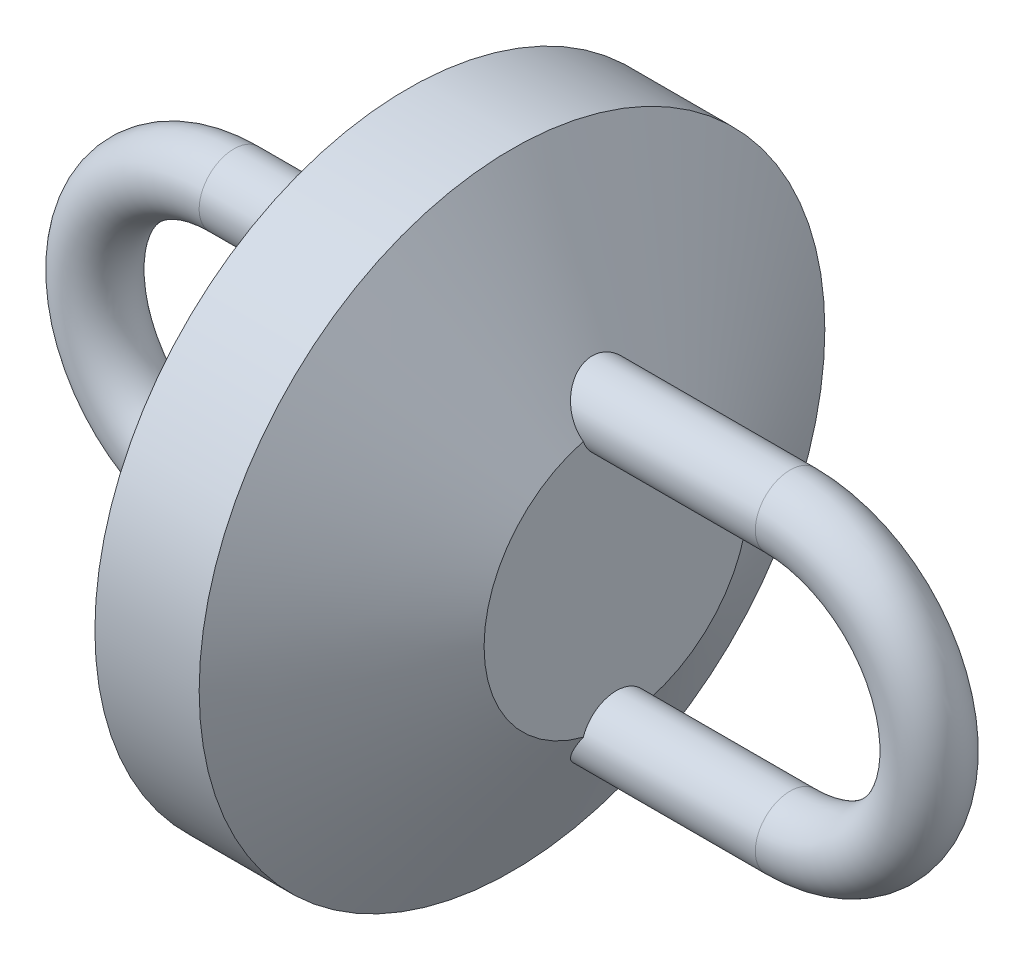
ISO-10303-21;
HEADER;
FILE_DESCRIPTION(('STEP AP214'),'2;1');
FILE_NAME('part.step','',(''),(''),'','','');
FILE_SCHEMA(('AUTOMOTIVE_DESIGN { 1 0 10303 214 1 1 1 1 }'));
ENDSEC;
DATA;
#1=APPLICATION_CONTEXT('core data for automotive mechanical design processes');
#2=APPLICATION_PROTOCOL_DEFINITION('international standard','automotive_design',2000,#1);
#3=PRODUCT_CONTEXT('',#1,'mechanical');
#4=PRODUCT('Part','Part','',(#3));
#5=PRODUCT_RELATED_PRODUCT_CATEGORY('part','',(#4));
#6=PRODUCT_DEFINITION_FORMATION('','',#4);
#7=PRODUCT_DEFINITION_CONTEXT('part definition',#1,'design');
#8=PRODUCT_DEFINITION('design','',#6,#7);
#9=PRODUCT_DEFINITION_SHAPE('','',#8);
#10=(LENGTH_UNIT() NAMED_UNIT(*) SI_UNIT(.MILLI.,.METRE.));
#11=(NAMED_UNIT(*) PLANE_ANGLE_UNIT() SI_UNIT($,.RADIAN.));
#12=(NAMED_UNIT(*) SI_UNIT($,.STERADIAN.) SOLID_ANGLE_UNIT());
#13=UNCERTAINTY_MEASURE_WITH_UNIT(LENGTH_MEASURE(1.E-05),#10,'distance_accuracy_value','');
#14=(GEOMETRIC_REPRESENTATION_CONTEXT(3) GLOBAL_UNCERTAINTY_ASSIGNED_CONTEXT((#13)) GLOBAL_UNIT_ASSIGNED_CONTEXT((#10,
#11,#12)) REPRESENTATION_CONTEXT('',''));
#15=CARTESIAN_POINT('',(0.,0.,0.));
#16=DIRECTION('',(0.,0.,1.));
#17=DIRECTION('',(1.,0.,0.));
#18=AXIS2_PLACEMENT_3D('',#15,#16,#17);
#19=CARTESIAN_POINT('',(8.,-4.,0.));
#20=DIRECTION('',(-1.,0.,0.));
#21=DIRECTION('',(0.,-1.,0.));
#22=AXIS2_PLACEMENT_3D('',#19,#20,#21);
#23=CYLINDRICAL_SURFACE('',#22,1.);
#24=CARTESIAN_POINT('',(-7.99999999999999,-4.,0.));
#25=DIRECTION('',(1.,0.,0.));
#26=DIRECTION('',(0.,1.,0.));
#27=AXIS2_PLACEMENT_3D('',#24,#25,#26);
#28=CIRCLE('',#27,1.);
#29=CARTESIAN_POINT('',(-7.99999999999999,-5.,0.));
#30=VERTEX_POINT('',#29);
#31=EDGE_CURVE('E136',#30,#30,#28,.T.);
#32=ORIENTED_EDGE('',*,*,#31,.T.);
#33=EDGE_LOOP('',(#32));
#34=FACE_BOUND('',#33,.T.);
#35=CARTESIAN_POINT('',(-3.,-4.,0.));
#36=DIRECTION('',(1.,0.,0.));
#37=DIRECTION('',(0.,0.,-1.));
#38=AXIS2_PLACEMENT_3D('',#35,#36,#37);
#39=CIRCLE('',#38,1.);
#40=CARTESIAN_POINT('',(-3.,-4.,-1.));
#41=VERTEX_POINT('',#40);
#42=EDGE_CURVE('E12',#41,#41,#39,.T.);
#43=ORIENTED_EDGE('',*,*,#42,.F.);
#44=EDGE_LOOP('',(#43));
#45=FACE_BOUND('',#44,.T.);
#46=ADVANCED_FACE('F48',(#34,#45),#23,.T.);
#47=CARTESIAN_POINT('',(-8.00000000000001,4.00000000000001,0.));
#48=DIRECTION('',(1.,0.,0.));
#49=DIRECTION('',(0.,0.,-1.));
#50=AXIS2_PLACEMENT_3D('',#47,#48,#49);
#51=CYLINDRICAL_SURFACE('',#50,1.);
#52=CARTESIAN_POINT('',(-8.00000000000001,4.00000000000001,0.));
#53=DIRECTION('',(-1.,0.,0.));
#54=DIRECTION('',(0.,-1.,0.));
#55=AXIS2_PLACEMENT_3D('',#52,#53,#54);
#56=CIRCLE('',#55,1.);
#57=CARTESIAN_POINT('',(-8.00000000000001,4.99999999999999,0.));
#58=VERTEX_POINT('',#57);
#59=EDGE_CURVE('E81',#58,#58,#56,.T.);
#60=ORIENTED_EDGE('',*,*,#59,.F.);
#61=EDGE_LOOP('',(#60));
#62=FACE_BOUND('',#61,.T.);
#63=CARTESIAN_POINT('',(-3.,4.00000000000001,0.));
#64=DIRECTION('',(1.,0.,0.));
#65=DIRECTION('',(0.,0.,-1.));
#66=AXIS2_PLACEMENT_3D('',#63,#64,#65);
#67=CIRCLE('',#66,1.);
#68=CARTESIAN_POINT('',(-3.,4.00000000000001,-1.));
#69=VERTEX_POINT('',#68);
#70=EDGE_CURVE('E53',#69,#69,#67,.T.);
#71=ORIENTED_EDGE('',*,*,#70,.F.);
#72=EDGE_LOOP('',(#71));
#73=FACE_BOUND('',#72,.T.);
#74=ADVANCED_FACE('F50',(#62,#73),#51,.T.);
#75=CARTESIAN_POINT('',(-8.00000000000001,0.,0.));
#76=DIRECTION('',(0.,0.,-1.));
#77=DIRECTION('',(-1.,0.,0.));
#78=AXIS2_PLACEMENT_3D('',#75,#76,#77);
#79=TOROIDAL_SURFACE('',#78,3.99999999999999,1.);
#80=CARTESIAN_POINT('',(-8.00000000000001,0.,0.));
#81=DIRECTION('',(0.,0.,-1.));
#82=DIRECTION('',(-1.,0.,0.));
#83=AXIS2_PLACEMENT_3D('',#80,#81,#82);
#84=CIRCLE('',#83,4.99999999999999);
#85=EDGE_CURVE('',#30,#58,#84,.T.);
#86=ORIENTED_EDGE('',*,*,#31,.F.);
#87=ORIENTED_EDGE('',*,*,#59,.T.);
#88=ORIENTED_EDGE('',*,*,#85,.T.);
#89=ORIENTED_EDGE('',*,*,#85,.F.);
#90=EDGE_LOOP('',(#86,#88,#87,#89));
#91=FACE_BOUND('',#90,.T.);
#92=ADVANCED_FACE('F103',(#91),#79,.T.);
#93=CARTESIAN_POINT('',(0.,0.,0.));
#94=DIRECTION('',(-1.,0.,0.));
#95=DIRECTION('',(0.,0.,-1.));
#96=AXIS2_PLACEMENT_3D('',#93,#94,#95);
#97=CONICAL_SURFACE('',#96,9.,1.0471975511966);
#98=CARTESIAN_POINT('',(0.,0.,0.));
#99=DIRECTION('',(1.,0.,0.));
#100=DIRECTION('',(0.,0.,-1.));
#101=AXIS2_PLACEMENT_3D('',#98,#99,#100);
#102=CIRCLE('',#101,9.);
#103=CARTESIAN_POINT('',(0.,0.,-9.));
#104=VERTEX_POINT('',#103);
#105=EDGE_CURVE('E88',#104,#104,#102,.T.);
#106=ORIENTED_EDGE('',*,*,#105,.T.);
#107=EDGE_LOOP('',(#106));
#108=FACE_BOUND('',#107,.T.);
#109=CARTESIAN_POINT('',(3.,0.,0.));
#110=DIRECTION('',(1.,0.,0.));
#111=DIRECTION('',(0.,0.,-1.));
#112=AXIS2_PLACEMENT_3D('',#109,#110,#111);
#113=CIRCLE('',#112,3.80384757729334);
#114=CARTESIAN_POINT('',(3.,-3.68365704891005,-0.948644895256228));
#115=VERTEX_POINT('',#114);
#116=CARTESIAN_POINT('',(3.,3.68365704891005,-0.948644895256224));
#117=VERTEX_POINT('',#116);
#118=EDGE_CURVE('E70',#115,#117,#113,.T.);
#119=ORIENTED_EDGE('',*,*,#118,.F.);
#120=CARTESIAN_POINT('',(3.0002,-3.68332764104665,-0.948534984634156));
#121=CARTESIAN_POINT('',(2.95759943657396,-3.75338995209897,-0.971967907151152));
#122=CARTESIAN_POINT('',(2.91478164401938,-3.82604662461921,-0.9875503548847));
#123=CARTESIAN_POINT('',(2.83004548437174,-3.97377515801792,-1.00240658342121));
#124=CARTESIAN_POINT('',(2.78812989430261,-4.04885307526672,-1.00163568961688));
#125=CARTESIAN_POINT('',(2.71213492602426,-4.18840313390063,-0.984266239621334));
#126=CARTESIAN_POINT('',(2.6777503346678,-4.25297042555942,-0.969764529480625));
#127=CARTESIAN_POINT('',(2.61181138054054,-4.3791522177578,-0.927713008530373));
#128=CARTESIAN_POINT('',(2.58025194429052,-4.44077191502847,-0.900187169420704));
#129=CARTESIAN_POINT('',(2.52320267425814,-4.55396533615952,-0.834899303889589));
#130=CARTESIAN_POINT('',(2.49743217645703,-4.60594744449708,-0.798093747517181));
#131=CARTESIAN_POINT('',(2.44991992562461,-4.70296075182324,-0.714109724889099));
#132=CARTESIAN_POINT('',(2.42817627558597,-4.74799522209587,-0.666936165916183));
#133=CARTESIAN_POINT('',(2.39173023610866,-4.8241833038826,-0.569311512022973));
#134=CARTESIAN_POINT('',(2.37651068967154,-4.85632890765097,-0.519827528239961));
#135=CARTESIAN_POINT('',(2.35044111351649,-4.91171329781438,-0.415066461957972));
#136=CARTESIAN_POINT('',(2.33958742851684,-4.93495953434121,-0.359794274661787));
#137=CARTESIAN_POINT('',(2.3235266748639,-4.96947031064072,-0.25109248179775));
#138=CARTESIAN_POINT('',(2.31786133584249,-4.98170508374859,-0.198037058349714));
#139=CARTESIAN_POINT('',(2.31060435704355,-4.99739024937846,-0.0903752598597315));
#140=CARTESIAN_POINT('',(2.30901112466939,-5.00084407611661,-0.0357694996039675));
#141=CARTESIAN_POINT('',(2.30992684998165,-4.99886185645522,0.0701944101728268));
#142=CARTESIAN_POINT('',(2.31221279830476,-4.99390909109736,0.121564426601773));
#143=CARTESIAN_POINT('',(2.3203899899277,-4.97624736906729,0.222649928931976));
#144=CARTESIAN_POINT('',(2.32628097424629,-4.96353896955026,0.272365533413624));
#145=CARTESIAN_POINT('',(2.34148664316452,-4.93089724451758,0.368814185195242));
#146=CARTESIAN_POINT('',(2.35080232328785,-4.91096181820334,0.41554636060257));
#147=CARTESIAN_POINT('',(2.37258799951497,-4.86464915649527,0.504891397758548));
#148=CARTESIAN_POINT('',(2.38505850810783,-4.83827087450978,0.547503588676471));
#149=CARTESIAN_POINT('',(2.41353194458997,-4.77853667549302,0.629755754636888));
#150=CARTESIAN_POINT('',(2.42968117867158,-4.74489618685341,0.669137849959857));
#151=CARTESIAN_POINT('',(2.46469849195879,-4.67270029339158,0.741684683515043));
#152=CARTESIAN_POINT('',(2.48356746823333,-4.63414326740413,0.774847362022064));
#153=CARTESIAN_POINT('',(2.52534887798382,-4.54976964499737,0.837098350264238));
#154=CARTESIAN_POINT('',(2.54846991421972,-4.50361356932545,0.865585766544514));
#155=CARTESIAN_POINT('',(2.59692454517825,-4.40827429294587,0.914431235848355));
#156=CARTESIAN_POINT('',(2.62225893511082,-4.35909000615722,0.934786352354099));
#157=CARTESIAN_POINT('',(2.67736817739746,-4.2537898824039,0.969001395892512));
#158=CARTESIAN_POINT('',(2.70733122801007,-4.19748350956145,0.981971004617524));
#159=CARTESIAN_POINT('',(2.76874428265821,-4.08426227889478,0.998084376980811));
#160=CARTESIAN_POINT('',(2.80019506451183,-4.02734711508797,1.00122294179099));
#161=CARTESIAN_POINT('',(2.85975582301872,-3.92174455146499,0.998142753219393));
#162=CARTESIAN_POINT('',(2.88776152824135,-3.87295902630567,0.993099751352367));
#163=CARTESIAN_POINT('',(2.94394246067142,-3.77686851710589,0.9760064586665));
#164=CARTESIAN_POINT('',(2.9721172195063,-3.72956068877476,0.963970631965558));
#165=CARTESIAN_POINT('',(3.0002,-3.68332764104665,0.948534984634156));
#166=B_SPLINE_CURVE_WITH_KNOTS('',3,(#120,#121,#122,#123,#124,#125,#126,#127,#128,#129,#130,
#131,#132,#133,#134,#135,#136,#137,#138,#139,#140,#141,#142,#143,#144,#145,#146,#147,#148,#149,
#150,#151,#152,#153,#154,#155,#156,#157,#158,#159,#160,#161,#162,#163,#164,#165),.UNSPECIFIED.,
.F.,.F.,(4,2,2,2,2,2,2,2,2,2,2,2,2,2,2,2,2,2,2,2,2,2,4),(0.,0.255607757675948,0.511913882904664,
0.734480930070689,0.956639913185159,1.16161469593597,1.36649267013472,1.54830199819294,
1.72995878945777,1.89333755190195,2.05665240729901,2.21089307932109,2.36512267218789,
2.51939713349994,2.67369667218209,2.83576947312922,2.99789585437404,3.1740516051407,
3.35027090717794,3.54472918837461,3.73929028516831,3.90827715533353,4.07691572735082),.UNSPECIFIED.);
#167=CARTESIAN_POINT('',(3.,-3.68365704891005,0.948644895256228));
#168=VERTEX_POINT('',#167);
#169=EDGE_CURVE('E86',#115,#168,#166,.T.);
#170=ORIENTED_EDGE('',*,*,#169,.T.);
#171=CARTESIAN_POINT('',(3.,3.68365704891005,0.948644895256224));
#172=VERTEX_POINT('',#171);
#173=EDGE_CURVE('E65',#172,#168,#113,.T.);
#174=ORIENTED_EDGE('',*,*,#173,.F.);
#175=CARTESIAN_POINT('',(3.0002,3.68332764104665,0.948534984634153));
#176=CARTESIAN_POINT('',(2.95759943657396,3.75338995209897,0.971967907151149));
#177=CARTESIAN_POINT('',(2.91478164401938,3.82604662461921,0.987550354884698));
#178=CARTESIAN_POINT('',(2.83004548437174,3.97377515801792,1.00240658342121));
#179=CARTESIAN_POINT('',(2.78812989430262,4.04885307526672,1.00163568961688));
#180=CARTESIAN_POINT('',(2.71213492602426,4.18840313390063,0.984266239621336));
#181=CARTESIAN_POINT('',(2.6777503346678,4.25297042555942,0.969764529480627));
#182=CARTESIAN_POINT('',(2.61181138054054,4.3791522177578,0.927713008530377));
#183=CARTESIAN_POINT('',(2.58025194429052,4.44077191502847,0.900187169420709));
#184=CARTESIAN_POINT('',(2.52320267425813,4.55396533615952,0.834899303889595));
#185=CARTESIAN_POINT('',(2.49743217645702,4.60594744449708,0.798093747517187));
#186=CARTESIAN_POINT('',(2.4499199256246,4.70296075182325,0.714109724889106));
#187=CARTESIAN_POINT('',(2.42817627558597,4.74799522209587,0.666936165916191));
#188=CARTESIAN_POINT('',(2.39173023610866,4.82418330388261,0.569311512022981));
#189=CARTESIAN_POINT('',(2.37651068967154,4.85632890765097,0.519827528239969));
#190=CARTESIAN_POINT('',(2.35044111351649,4.91171329781439,0.41506646195798));
#191=CARTESIAN_POINT('',(2.33958742851683,4.93495953434122,0.359794274661796));
#192=CARTESIAN_POINT('',(2.3235266748639,4.96947031064073,0.251092481797758));
#193=CARTESIAN_POINT('',(2.31786133584249,4.9817050837486,0.198037058349723));
#194=CARTESIAN_POINT('',(2.31060435704355,4.99739024937847,0.0903752598597401));
#195=CARTESIAN_POINT('',(2.30901112466938,5.00084407611662,0.035769499603976));
#196=CARTESIAN_POINT('',(2.30992684998165,4.99886185645523,-0.0701944101728183));
#197=CARTESIAN_POINT('',(2.31221279830475,4.99390909109737,-0.121564426601765));
#198=CARTESIAN_POINT('',(2.32038998992769,4.9762473690673,-0.222649928931968));
#199=CARTESIAN_POINT('',(2.32628097424628,4.96353896955027,-0.272365533413616));
#200=CARTESIAN_POINT('',(2.34148664316451,4.93089724451759,-0.368814185195234));
#201=CARTESIAN_POINT('',(2.35080232328785,4.91096181820335,-0.415546360602562));
#202=CARTESIAN_POINT('',(2.37258799951496,4.86464915649529,-0.504891397758541));
#203=CARTESIAN_POINT('',(2.38505850810782,4.83827087450979,-0.547503588676463));
#204=CARTESIAN_POINT('',(2.41353194458996,4.77853667549304,-0.629755754636881));
#205=CARTESIAN_POINT('',(2.42968117867157,4.74489618685343,-0.66913784995985));
#206=CARTESIAN_POINT('',(2.46469849195878,4.6727002933916,-0.741684683515037));
#207=CARTESIAN_POINT('',(2.48356746823332,4.63414326740415,-0.774847362022059));
#208=CARTESIAN_POINT('',(2.52534887798381,4.54976964499738,-0.837098350264233));
#209=CARTESIAN_POINT('',(2.54846991421971,4.50361356932546,-0.865585766544509));
#210=CARTESIAN_POINT('',(2.59692454517824,4.40827429294589,-0.914431235848351));
#211=CARTESIAN_POINT('',(2.62225893511081,4.35909000615724,-0.934786352354095));
#212=CARTESIAN_POINT('',(2.67736817739745,4.25378988240392,-0.96900139589251));
#213=CARTESIAN_POINT('',(2.70733122801005,4.19748350956147,-0.981971004617522));
#214=CARTESIAN_POINT('',(2.7687442826582,4.0842622788948,-0.99808437698081));
#215=CARTESIAN_POINT('',(2.80019506451182,4.02734711508799,-1.00122294179099));
#216=CARTESIAN_POINT('',(2.85975582301871,3.92174455146501,-0.998142753219394));
#217=CARTESIAN_POINT('',(2.88776152824135,3.87295902630569,-0.993099751352368));
#218=CARTESIAN_POINT('',(2.94394246067142,3.7768685171059,-0.9760064586665));
#219=CARTESIAN_POINT('',(2.9721172195063,3.72956068877477,-0.963970631965556));
#220=CARTESIAN_POINT('',(3.0002,3.68332764104665,-0.948534984634153));
#221=B_SPLINE_CURVE_WITH_KNOTS('',3,(#175,#176,#177,#178,#179,#180,#181,#182,#183,#184,#185,
#186,#187,#188,#189,#190,#191,#192,#193,#194,#195,#196,#197,#198,#199,#200,#201,#202,#203,#204,
#205,#206,#207,#208,#209,#210,#211,#212,#213,#214,#215,#216,#217,#218,#219,#220),.UNSPECIFIED.,
.F.,.F.,(4,2,2,2,2,2,2,2,2,2,2,2,2,2,2,2,2,2,2,2,2,2,4),(0.,0.255607757675948,0.511913882904664,
0.734480930070689,0.956639913185159,1.16161469593597,1.36649267013472,1.54830199819295,
1.72995878945778,1.89333755190195,2.05665240729902,2.21089307932109,2.3651226721879,
2.51939713349994,2.67369667218209,2.83576947312923,2.99789585437404,3.1740516051407,
3.35027090717794,3.54472918837461,3.73929028516831,3.90827715533354,4.07691572735084),.UNSPECIFIED.);
#222=EDGE_CURVE('E80',#172,#117,#221,.T.);
#223=ORIENTED_EDGE('',*,*,#222,.T.);
#224=EDGE_LOOP('',(#119,#170,#174,#223));
#225=FACE_BOUND('',#224,.T.);
#226=ADVANCED_FACE('F84',(#108,#225),#97,.T.);
#227=CARTESIAN_POINT('',(-3.,0.,0.));
#228=DIRECTION('',(1.,0.,0.));
#229=DIRECTION('',(0.,0.,-1.));
#230=AXIS2_PLACEMENT_3D('',#227,#228,#229);
#231=CYLINDRICAL_SURFACE('',#230,9.);
#232=CARTESIAN_POINT('',(-3.,0.,0.));
#233=DIRECTION('',(1.,0.,0.));
#234=DIRECTION('',(0.,0.,-1.));
#235=AXIS2_PLACEMENT_3D('',#232,#233,#234);
#236=CIRCLE('',#235,9.);
#237=CARTESIAN_POINT('',(-3.,0.,-9.));
#238=VERTEX_POINT('',#237);
#239=EDGE_CURVE('E154',#238,#238,#236,.T.);
#240=ORIENTED_EDGE('',*,*,#239,.T.);
#241=EDGE_LOOP('',(#240));
#242=FACE_BOUND('',#241,.T.);
#243=ORIENTED_EDGE('',*,*,#105,.F.);
#244=EDGE_LOOP('',(#243));
#245=FACE_BOUND('',#244,.T.);
#246=ADVANCED_FACE('F102',(#242,#245),#231,.T.);
#247=CARTESIAN_POINT('',(-3.,0.,0.));
#248=DIRECTION('',(1.,0.,0.));
#249=DIRECTION('',(0.,0.,-1.));
#250=AXIS2_PLACEMENT_3D('',#247,#248,#249);
#251=PLANE('',#250);
#252=ORIENTED_EDGE('',*,*,#42,.T.);
#253=EDGE_LOOP('',(#252));
#254=FACE_BOUND('',#253,.T.);
#255=ORIENTED_EDGE('',*,*,#70,.T.);
#256=EDGE_LOOP('',(#255));
#257=FACE_BOUND('',#256,.T.);
#258=ORIENTED_EDGE('',*,*,#239,.F.);
#259=EDGE_LOOP('',(#258));
#260=FACE_BOUND('',#259,.T.);
#261=ADVANCED_FACE('F105',(#254,#257,#260),#251,.F.);
#262=CARTESIAN_POINT('',(3.,0.,0.));
#263=DIRECTION('',(1.,0.,0.));
#264=DIRECTION('',(0.,0.,-1.));
#265=AXIS2_PLACEMENT_3D('',#262,#263,#264);
#266=PLANE('',#265);
#267=CARTESIAN_POINT('',(3.,-4.,0.));
#268=DIRECTION('',(1.,0.,0.));
#269=DIRECTION('',(0.,0.,-1.));
#270=AXIS2_PLACEMENT_3D('',#267,#268,#269);
#271=CIRCLE('',#270,1.);
#272=EDGE_CURVE('E116',#115,#168,#271,.T.);
#273=ORIENTED_EDGE('',*,*,#272,.F.);
#274=ORIENTED_EDGE('',*,*,#118,.T.);
#275=CARTESIAN_POINT('',(3.,4.00000000000001,0.));
#276=DIRECTION('',(1.,0.,0.));
#277=DIRECTION('',(0.,0.,-1.));
#278=AXIS2_PLACEMENT_3D('',#275,#276,#277);
#279=CIRCLE('',#278,1.);
#280=EDGE_CURVE('E76',#172,#117,#279,.T.);
#281=ORIENTED_EDGE('',*,*,#280,.F.);
#282=ORIENTED_EDGE('',*,*,#173,.T.);
#283=EDGE_LOOP('',(#273,#274,#281,#282));
#284=FACE_BOUND('',#283,.T.);
#285=ADVANCED_FACE('F77',(#284),#266,.T.);
#286=CARTESIAN_POINT('',(8.,-4.,0.));
#287=DIRECTION('',(1.,0.,0.));
#288=DIRECTION('',(0.,1.,0.));
#289=AXIS2_PLACEMENT_3D('',#286,#287,#288);
#290=CIRCLE('',#289,1.);
#291=CARTESIAN_POINT('',(8.,-5.,0.));
#292=VERTEX_POINT('',#291);
#293=EDGE_CURVE('E137',#292,#292,#290,.T.);
#294=ORIENTED_EDGE('',*,*,#293,.F.);
#295=EDGE_LOOP('',(#294));
#296=FACE_BOUND('',#295,.T.);
#297=ORIENTED_EDGE('',*,*,#169,.F.);
#298=ORIENTED_EDGE('',*,*,#272,.T.);
#299=EDGE_LOOP('',(#297,#298));
#300=FACE_BOUND('',#299,.T.);
#301=ADVANCED_FACE('F123',(#296,#300),#23,.T.);
#302=CARTESIAN_POINT('',(8.,0.,0.));
#303=DIRECTION('',(0.,0.,-1.));
#304=DIRECTION('',(-1.,0.,0.));
#305=AXIS2_PLACEMENT_3D('',#302,#303,#304);
#306=TOROIDAL_SURFACE('',#305,4.,1.);
#307=CARTESIAN_POINT('',(7.99999999999999,4.,0.));
#308=DIRECTION('',(-1.,0.,0.));
#309=DIRECTION('',(0.,-1.,0.));
#310=AXIS2_PLACEMENT_3D('',#307,#308,#309);
#311=CIRCLE('',#310,1.);
#312=CARTESIAN_POINT('',(7.99999999999999,5.,0.));
#313=VERTEX_POINT('',#312);
#314=EDGE_CURVE('E115',#313,#313,#311,.T.);
#315=CARTESIAN_POINT('',(8.,0.,0.));
#316=DIRECTION('',(0.,0.,-1.));
#317=DIRECTION('',(-1.,0.,0.));
#318=AXIS2_PLACEMENT_3D('',#315,#316,#317);
#319=CIRCLE('',#318,5.);
#320=EDGE_CURVE('',#313,#292,#319,.T.);
#321=ORIENTED_EDGE('',*,*,#314,.F.);
#322=ORIENTED_EDGE('',*,*,#293,.T.);
#323=ORIENTED_EDGE('',*,*,#320,.T.);
#324=ORIENTED_EDGE('',*,*,#320,.F.);
#325=EDGE_LOOP('',(#321,#323,#322,#324));
#326=FACE_BOUND('',#325,.T.);
#327=ADVANCED_FACE('F124',(#326),#306,.T.);
#328=ORIENTED_EDGE('',*,*,#314,.T.);
#329=EDGE_LOOP('',(#328));
#330=FACE_BOUND('',#329,.T.);
#331=ORIENTED_EDGE('',*,*,#222,.F.);
#332=ORIENTED_EDGE('',*,*,#280,.T.);
#333=EDGE_LOOP('',(#331,#332));
#334=FACE_BOUND('',#333,.T.);
#335=ADVANCED_FACE('F90',(#330,#334),#51,.T.);
#336=CLOSED_SHELL('',(#46,#74,#92,#226,#246,#261,#285,#301,#327,#335));
#337=MANIFOLD_SOLID_BREP('B2',#336);
#338=ADVANCED_BREP_SHAPE_REPRESENTATION('',(#18,#337),#14);
#339=SHAPE_DEFINITION_REPRESENTATION(#9,#338);
ENDSEC;
END-ISO-10303-21;
